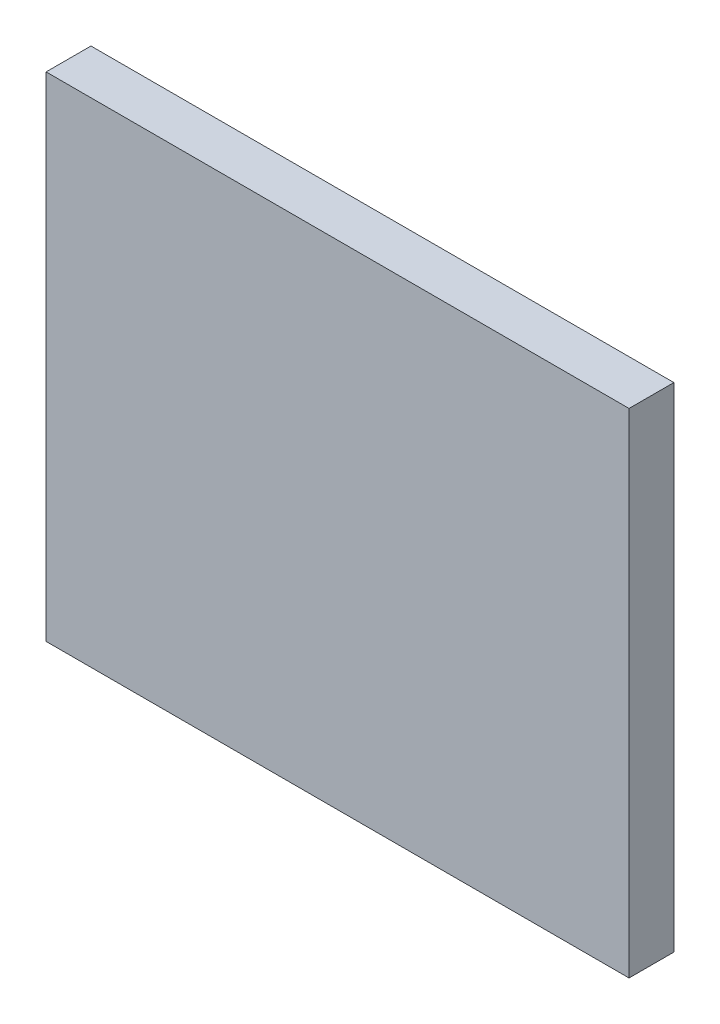
ISO-10303-21;
HEADER;
FILE_DESCRIPTION(('STEP AP214'),'2;1');
FILE_NAME('part.step','',(''),(''),'','','');
FILE_SCHEMA(('AUTOMOTIVE_DESIGN { 1 0 10303 214 1 1 1 1 }'));
ENDSEC;
DATA;
#1=APPLICATION_CONTEXT('core data for automotive mechanical design processes');
#2=APPLICATION_PROTOCOL_DEFINITION('international standard','automotive_design',2000,#1);
#3=PRODUCT_CONTEXT('',#1,'mechanical');
#4=PRODUCT('Part','Part','',(#3));
#5=PRODUCT_RELATED_PRODUCT_CATEGORY('part','',(#4));
#6=PRODUCT_DEFINITION_FORMATION('','',#4);
#7=PRODUCT_DEFINITION_CONTEXT('part definition',#1,'design');
#8=PRODUCT_DEFINITION('design','',#6,#7);
#9=PRODUCT_DEFINITION_SHAPE('','',#8);
#10=(LENGTH_UNIT() NAMED_UNIT(*) SI_UNIT(.MILLI.,.METRE.));
#11=(NAMED_UNIT(*) PLANE_ANGLE_UNIT() SI_UNIT($,.RADIAN.));
#12=(NAMED_UNIT(*) SI_UNIT($,.STERADIAN.) SOLID_ANGLE_UNIT());
#13=UNCERTAINTY_MEASURE_WITH_UNIT(LENGTH_MEASURE(1.E-05),#10,'distance_accuracy_value','');
#14=(GEOMETRIC_REPRESENTATION_CONTEXT(3) GLOBAL_UNCERTAINTY_ASSIGNED_CONTEXT((#13)) GLOBAL_UNIT_ASSIGNED_CONTEXT((#10,
#11,#12)) REPRESENTATION_CONTEXT('',''));
#15=CARTESIAN_POINT('',(0.,0.,0.));
#16=DIRECTION('',(0.,0.,1.));
#17=DIRECTION('',(1.,0.,0.));
#18=AXIS2_PLACEMENT_3D('',#15,#16,#17);
#19=CARTESIAN_POINT('',(0.,0.,25.4));
#20=DIRECTION('',(1.,0.,0.));
#21=DIRECTION('',(0.,0.,-1.));
#22=AXIS2_PLACEMENT_3D('',#19,#20,#21);
#23=PLANE('',#22);
#24=DIRECTION('',(0.,-1.,0.));
#25=VECTOR('',#24,1.);
#26=CARTESIAN_POINT('',(0.,0.,0.));
#27=LINE('',#26,#25);
#28=CARTESIAN_POINT('',(0.,279.4,0.));
#29=VERTEX_POINT('',#28);
#30=CARTESIAN_POINT('',(0.,0.,0.));
#31=VERTEX_POINT('',#30);
#32=EDGE_CURVE('E113',#29,#31,#27,.T.);
#33=ORIENTED_EDGE('',*,*,#32,.T.);
#34=DIRECTION('',(0.,0.,-1.));
#35=VECTOR('',#34,1.);
#36=CARTESIAN_POINT('',(0.,0.,25.4));
#37=LINE('',#36,#35);
#38=CARTESIAN_POINT('',(0.,0.,25.4));
#39=VERTEX_POINT('',#38);
#40=EDGE_CURVE('E11',#39,#31,#37,.T.);
#41=ORIENTED_EDGE('',*,*,#40,.F.);
#42=DIRECTION('',(0.,-1.,0.));
#43=VECTOR('',#42,1.);
#44=CARTESIAN_POINT('',(0.,0.,25.4));
#45=LINE('',#44,#43);
#46=CARTESIAN_POINT('',(0.,279.4,25.4));
#47=VERTEX_POINT('',#46);
#48=EDGE_CURVE('E97',#47,#39,#45,.T.);
#49=ORIENTED_EDGE('',*,*,#48,.F.);
#50=DIRECTION('',(0.,0.,-1.));
#51=VECTOR('',#50,1.);
#52=CARTESIAN_POINT('',(0.,279.4,25.4));
#53=LINE('',#52,#51);
#54=EDGE_CURVE('E109',#47,#29,#53,.T.);
#55=ORIENTED_EDGE('',*,*,#54,.T.);
#56=EDGE_LOOP('',(#33,#41,#49,#55));
#57=FACE_BOUND('',#56,.T.);
#58=ADVANCED_FACE('F45',(#57),#23,.F.);
#59=CARTESIAN_POINT('',(0.,0.,25.4));
#60=DIRECTION('',(0.,1.,0.));
#61=DIRECTION('',(0.,0.,1.));
#62=AXIS2_PLACEMENT_3D('',#59,#60,#61);
#63=PLANE('',#62);
#64=DIRECTION('',(1.,0.,0.));
#65=VECTOR('',#64,1.);
#66=CARTESIAN_POINT('',(0.,0.,0.));
#67=LINE('',#66,#65);
#68=CARTESIAN_POINT('',(330.2,0.,0.));
#69=VERTEX_POINT('',#68);
#70=EDGE_CURVE('E102',#31,#69,#67,.T.);
#71=ORIENTED_EDGE('',*,*,#70,.T.);
#72=DIRECTION('',(0.,0.,-1.));
#73=VECTOR('',#72,1.);
#74=CARTESIAN_POINT('',(330.2,0.,25.4));
#75=LINE('',#74,#73);
#76=CARTESIAN_POINT('',(330.2,0.,25.4));
#77=VERTEX_POINT('',#76);
#78=EDGE_CURVE('E54',#77,#69,#75,.T.);
#79=ORIENTED_EDGE('',*,*,#78,.F.);
#80=DIRECTION('',(1.,0.,0.));
#81=VECTOR('',#80,1.);
#82=CARTESIAN_POINT('',(0.,0.,25.4));
#83=LINE('',#82,#81);
#84=EDGE_CURVE('E92',#39,#77,#83,.T.);
#85=ORIENTED_EDGE('',*,*,#84,.F.);
#86=ORIENTED_EDGE('',*,*,#40,.T.);
#87=EDGE_LOOP('',(#71,#79,#85,#86));
#88=FACE_BOUND('',#87,.T.);
#89=ADVANCED_FACE('F101',(#88),#63,.F.);
#90=CARTESIAN_POINT('',(330.2,0.,25.4));
#91=DIRECTION('',(-1.,0.,0.));
#92=DIRECTION('',(0.,0.,1.));
#93=AXIS2_PLACEMENT_3D('',#90,#91,#92);
#94=PLANE('',#93);
#95=DIRECTION('',(0.,1.,0.));
#96=VECTOR('',#95,1.);
#97=CARTESIAN_POINT('',(330.2,0.,0.));
#98=LINE('',#97,#96);
#99=CARTESIAN_POINT('',(330.2,279.4,0.));
#100=VERTEX_POINT('',#99);
#101=EDGE_CURVE('E79',#69,#100,#98,.T.);
#102=ORIENTED_EDGE('',*,*,#101,.T.);
#103=DIRECTION('',(0.,0.,-1.));
#104=VECTOR('',#103,1.);
#105=CARTESIAN_POINT('',(330.2,279.4,25.4));
#106=LINE('',#105,#104);
#107=CARTESIAN_POINT('',(330.2,279.4,25.4));
#108=VERTEX_POINT('',#107);
#109=EDGE_CURVE('E104',#108,#100,#106,.T.);
#110=ORIENTED_EDGE('',*,*,#109,.F.);
#111=DIRECTION('',(0.,1.,0.));
#112=VECTOR('',#111,1.);
#113=CARTESIAN_POINT('',(330.2,0.,25.4));
#114=LINE('',#113,#112);
#115=EDGE_CURVE('E95',#77,#108,#114,.T.);
#116=ORIENTED_EDGE('',*,*,#115,.F.);
#117=ORIENTED_EDGE('',*,*,#78,.T.);
#118=EDGE_LOOP('',(#102,#110,#116,#117));
#119=FACE_BOUND('',#118,.T.);
#120=ADVANCED_FACE('F105',(#119),#94,.F.);
#121=CARTESIAN_POINT('',(0.,279.4,25.4));
#122=DIRECTION('',(0.,-1.,0.));
#123=DIRECTION('',(0.,0.,-1.));
#124=AXIS2_PLACEMENT_3D('',#121,#122,#123);
#125=PLANE('',#124);
#126=DIRECTION('',(-1.,0.,0.));
#127=VECTOR('',#126,1.);
#128=CARTESIAN_POINT('',(0.,279.4,0.));
#129=LINE('',#128,#127);
#130=EDGE_CURVE('E85',#100,#29,#129,.T.);
#131=ORIENTED_EDGE('',*,*,#130,.T.);
#132=ORIENTED_EDGE('',*,*,#54,.F.);
#133=DIRECTION('',(-1.,0.,0.));
#134=VECTOR('',#133,1.);
#135=CARTESIAN_POINT('',(0.,279.4,25.4));
#136=LINE('',#135,#134);
#137=EDGE_CURVE('E62',#108,#47,#136,.T.);
#138=ORIENTED_EDGE('',*,*,#137,.F.);
#139=ORIENTED_EDGE('',*,*,#109,.T.);
#140=EDGE_LOOP('',(#131,#132,#138,#139));
#141=FACE_BOUND('',#140,.T.);
#142=ADVANCED_FACE('F126',(#141),#125,.F.);
#143=CARTESIAN_POINT('',(0.,0.,25.4));
#144=DIRECTION('',(0.,0.,-1.));
#145=DIRECTION('',(-1.,0.,0.));
#146=AXIS2_PLACEMENT_3D('',#143,#144,#145);
#147=PLANE('',#146);
#148=ORIENTED_EDGE('',*,*,#48,.T.);
#149=ORIENTED_EDGE('',*,*,#84,.T.);
#150=ORIENTED_EDGE('',*,*,#115,.T.);
#151=ORIENTED_EDGE('',*,*,#137,.T.);
#152=EDGE_LOOP('',(#148,#149,#150,#151));
#153=FACE_BOUND('',#152,.T.);
#154=ADVANCED_FACE('F93',(#153),#147,.F.);
#155=CARTESIAN_POINT('',(0.,0.,0.));
#156=DIRECTION('',(0.,0.,-1.));
#157=DIRECTION('',(-1.,0.,0.));
#158=AXIS2_PLACEMENT_3D('',#155,#156,#157);
#159=PLANE('',#158);
#160=ORIENTED_EDGE('',*,*,#32,.F.);
#161=ORIENTED_EDGE('',*,*,#130,.F.);
#162=ORIENTED_EDGE('',*,*,#101,.F.);
#163=ORIENTED_EDGE('',*,*,#70,.F.);
#164=EDGE_LOOP('',(#160,#161,#162,#163));
#165=FACE_BOUND('',#164,.T.);
#166=ADVANCED_FACE('F129',(#165),#159,.T.);
#167=CLOSED_SHELL('',(#58,#89,#120,#142,#154,#166));
#168=MANIFOLD_SOLID_BREP('B2',#167);
#169=ADVANCED_BREP_SHAPE_REPRESENTATION('',(#18,#168),#14);
#170=SHAPE_DEFINITION_REPRESENTATION(#9,#169);
ENDSEC;
END-ISO-10303-21;
